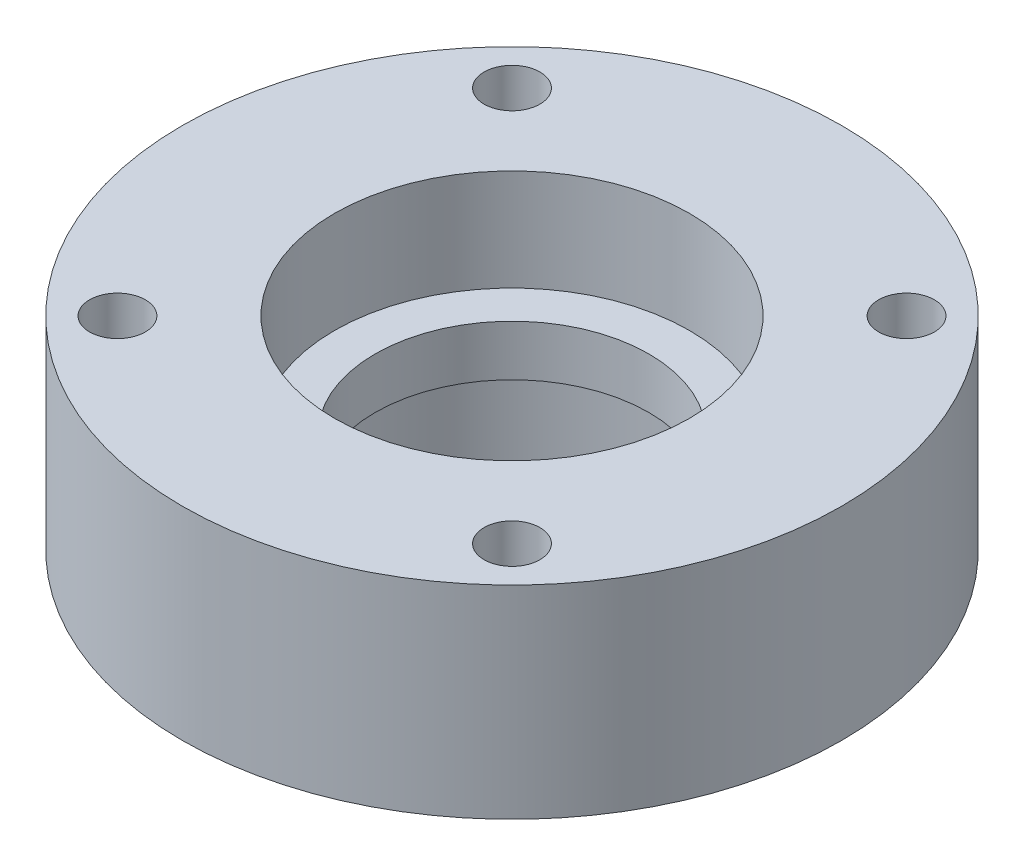
ISO-10303-21;
HEADER;
FILE_DESCRIPTION(('STEP AP214'),'2;1');
FILE_NAME('part.step','',(''),(''),'','','');
FILE_SCHEMA(('AUTOMOTIVE_DESIGN { 1 0 10303 214 1 1 1 1 }'));
ENDSEC;
DATA;
#1=APPLICATION_CONTEXT('core data for automotive mechanical design processes');
#2=APPLICATION_PROTOCOL_DEFINITION('international standard','automotive_design',2000,#1);
#3=PRODUCT_CONTEXT('',#1,'mechanical');
#4=PRODUCT('Part','Part','',(#3));
#5=PRODUCT_RELATED_PRODUCT_CATEGORY('part','',(#4));
#6=PRODUCT_DEFINITION_FORMATION('','',#4);
#7=PRODUCT_DEFINITION_CONTEXT('part definition',#1,'design');
#8=PRODUCT_DEFINITION('design','',#6,#7);
#9=PRODUCT_DEFINITION_SHAPE('','',#8);
#10=(LENGTH_UNIT() NAMED_UNIT(*) SI_UNIT(.MILLI.,.METRE.));
#11=(NAMED_UNIT(*) PLANE_ANGLE_UNIT() SI_UNIT($,.RADIAN.));
#12=(NAMED_UNIT(*) SI_UNIT($,.STERADIAN.) SOLID_ANGLE_UNIT());
#13=UNCERTAINTY_MEASURE_WITH_UNIT(LENGTH_MEASURE(1.E-05),#10,'distance_accuracy_value','');
#14=(GEOMETRIC_REPRESENTATION_CONTEXT(3) GLOBAL_UNCERTAINTY_ASSIGNED_CONTEXT((#13)) GLOBAL_UNIT_ASSIGNED_CONTEXT((#10,
#11,#12)) REPRESENTATION_CONTEXT('',''));
#15=CARTESIAN_POINT('',(0.,0.,0.));
#16=DIRECTION('',(0.,0.,1.));
#17=DIRECTION('',(1.,0.,0.));
#18=AXIS2_PLACEMENT_3D('',#15,#16,#17);
#19=CARTESIAN_POINT('',(17.5,5.,0.));
#20=DIRECTION('',(0.,1.,0.));
#21=DIRECTION('',(0.,0.,1.));
#22=AXIS2_PLACEMENT_3D('',#19,#20,#21);
#23=PLANE('',#22);
#24=CARTESIAN_POINT('',(0.,5.,0.));
#25=DIRECTION('',(0.,-1.,0.));
#26=DIRECTION('',(0.,0.,-1.));
#27=AXIS2_PLACEMENT_3D('',#24,#25,#26);
#28=CIRCLE('',#27,13.5);
#29=CARTESIAN_POINT('',(0.,5.,-13.5));
#30=VERTEX_POINT('',#29);
#31=EDGE_CURVE('E10',#30,#30,#28,.T.);
#32=ORIENTED_EDGE('',*,*,#31,.T.);
#33=EDGE_LOOP('',(#32));
#34=FACE_BOUND('',#33,.T.);
#35=CARTESIAN_POINT('',(0.,5.,0.));
#36=DIRECTION('',(0.,-1.,0.));
#37=DIRECTION('',(0.,0.,-1.));
#38=AXIS2_PLACEMENT_3D('',#35,#36,#37);
#39=CIRCLE('',#38,17.5);
#40=CARTESIAN_POINT('',(0.,5.,-17.5));
#41=VERTEX_POINT('',#40);
#42=EDGE_CURVE('E66',#41,#41,#39,.T.);
#43=ORIENTED_EDGE('',*,*,#42,.F.);
#44=EDGE_LOOP('',(#43));
#45=FACE_BOUND('',#44,.T.);
#46=ADVANCED_FACE('F32',(#34,#45),#23,.T.);
#47=CARTESIAN_POINT('',(0.,0.,0.));
#48=DIRECTION('',(0.,-1.,0.));
#49=DIRECTION('',(0.,0.,-1.));
#50=AXIS2_PLACEMENT_3D('',#47,#48,#49);
#51=CYLINDRICAL_SURFACE('',#50,13.5);
#52=CARTESIAN_POINT('',(0.,0.,0.));
#53=DIRECTION('',(0.,-1.,0.));
#54=DIRECTION('',(0.,0.,-1.));
#55=AXIS2_PLACEMENT_3D('',#52,#53,#54);
#56=CIRCLE('',#55,13.5);
#57=CARTESIAN_POINT('',(0.,0.,-13.5));
#58=VERTEX_POINT('',#57);
#59=EDGE_CURVE('E38',#58,#58,#56,.T.);
#60=ORIENTED_EDGE('',*,*,#59,.T.);
#61=EDGE_LOOP('',(#60));
#62=FACE_BOUND('',#61,.T.);
#63=ORIENTED_EDGE('',*,*,#31,.F.);
#64=EDGE_LOOP('',(#63));
#65=FACE_BOUND('',#64,.T.);
#66=ADVANCED_FACE('F145',(#62,#65),#51,.F.);
#67=CARTESIAN_POINT('',(13.5,0.,0.));
#68=DIRECTION('',(0.,-1.,0.));
#69=DIRECTION('',(0.,0.,-1.));
#70=AXIS2_PLACEMENT_3D('',#67,#68,#69);
#71=PLANE('',#70);
#72=CARTESIAN_POINT('',(0.,0.,0.));
#73=DIRECTION('',(0.,-1.,0.));
#74=DIRECTION('',(0.,0.,-1.));
#75=AXIS2_PLACEMENT_3D('',#72,#73,#74);
#76=CIRCLE('',#75,17.5);
#77=CARTESIAN_POINT('',(0.,0.,-17.5));
#78=VERTEX_POINT('',#77);
#79=EDGE_CURVE('E42',#78,#78,#76,.T.);
#80=ORIENTED_EDGE('',*,*,#79,.T.);
#81=EDGE_LOOP('',(#80));
#82=FACE_BOUND('',#81,.T.);
#83=ORIENTED_EDGE('',*,*,#59,.F.);
#84=EDGE_LOOP('',(#83));
#85=FACE_BOUND('',#84,.T.);
#86=ADVANCED_FACE('F139',(#82,#85),#71,.T.);
#87=CARTESIAN_POINT('',(0.,0.,0.));
#88=DIRECTION('',(0.,-1.,0.));
#89=DIRECTION('',(0.,0.,-1.));
#90=AXIS2_PLACEMENT_3D('',#87,#88,#89);
#91=CYLINDRICAL_SURFACE('',#90,17.5);
#92=CARTESIAN_POINT('',(0.,-10.,0.));
#93=DIRECTION('',(0.,-1.,0.));
#94=DIRECTION('',(0.,0.,-1.));
#95=AXIS2_PLACEMENT_3D('',#92,#93,#94);
#96=CIRCLE('',#95,17.5);
#97=CARTESIAN_POINT('',(0.,-10.,-17.5));
#98=VERTEX_POINT('',#97);
#99=EDGE_CURVE('E46',#98,#98,#96,.T.);
#100=ORIENTED_EDGE('',*,*,#99,.T.);
#101=EDGE_LOOP('',(#100));
#102=FACE_BOUND('',#101,.T.);
#103=ORIENTED_EDGE('',*,*,#79,.F.);
#104=EDGE_LOOP('',(#103));
#105=FACE_BOUND('',#104,.T.);
#106=ADVANCED_FACE('F133',(#102,#105),#91,.F.);
#107=CARTESIAN_POINT('',(17.5,-10.,0.));
#108=DIRECTION('',(0.,-1.,0.));
#109=DIRECTION('',(0.,0.,-1.));
#110=AXIS2_PLACEMENT_3D('',#107,#108,#109);
#111=PLANE('',#110);
#112=CARTESIAN_POINT('',(0.,-10.,0.));
#113=DIRECTION('',(0.,-1.,0.));
#114=DIRECTION('',(0.,0.,-1.));
#115=AXIS2_PLACEMENT_3D('',#112,#113,#114);
#116=CIRCLE('',#115,22.5);
#117=CARTESIAN_POINT('',(0.,-10.,-22.5));
#118=VERTEX_POINT('',#117);
#119=EDGE_CURVE('E51',#118,#118,#116,.T.);
#120=ORIENTED_EDGE('',*,*,#119,.T.);
#121=EDGE_LOOP('',(#120));
#122=FACE_BOUND('',#121,.T.);
#123=ORIENTED_EDGE('',*,*,#99,.F.);
#124=EDGE_LOOP('',(#123));
#125=FACE_BOUND('',#124,.T.);
#126=ADVANCED_FACE('F127',(#122,#125),#111,.T.);
#127=CARTESIAN_POINT('',(0.,0.,0.));
#128=DIRECTION('',(0.,-1.,0.));
#129=DIRECTION('',(0.,0.,-1.));
#130=AXIS2_PLACEMENT_3D('',#127,#128,#129);
#131=CYLINDRICAL_SURFACE('',#130,22.5);
#132=CARTESIAN_POINT('',(0.,-5.,0.));
#133=DIRECTION('',(0.,-1.,0.));
#134=DIRECTION('',(0.,0.,-1.));
#135=AXIS2_PLACEMENT_3D('',#132,#133,#134);
#136=CIRCLE('',#135,22.5);
#137=CARTESIAN_POINT('',(0.,-5.,-22.5));
#138=VERTEX_POINT('',#137);
#139=EDGE_CURVE('E54',#138,#138,#136,.T.);
#140=ORIENTED_EDGE('',*,*,#139,.T.);
#141=EDGE_LOOP('',(#140));
#142=FACE_BOUND('',#141,.T.);
#143=ORIENTED_EDGE('',*,*,#119,.F.);
#144=EDGE_LOOP('',(#143));
#145=FACE_BOUND('',#144,.T.);
#146=ADVANCED_FACE('F120',(#142,#145),#131,.T.);
#147=CARTESIAN_POINT('',(22.5,-5.,0.));
#148=DIRECTION('',(0.,-1.,0.));
#149=DIRECTION('',(0.,0.,-1.));
#150=AXIS2_PLACEMENT_3D('',#147,#148,#149);
#151=PLANE('',#150);
#152=CARTESIAN_POINT('',(-19.4454364826301,-5.,19.4454364826301));
#153=DIRECTION('',(0.,-1.,0.));
#154=DIRECTION('',(0.,0.,-1.));
#155=AXIS2_PLACEMENT_3D('',#152,#153,#154);
#156=CIRCLE('',#155,2.74999999999999);
#157=CARTESIAN_POINT('',(-19.4454364826301,-5.,16.6954364826301));
#158=VERTEX_POINT('',#157);
#159=EDGE_CURVE('E87',#158,#158,#156,.T.);
#160=ORIENTED_EDGE('',*,*,#159,.F.);
#161=EDGE_LOOP('',(#160));
#162=FACE_BOUND('',#161,.T.);
#163=CARTESIAN_POINT('',(-19.4454364826301,-5.,-19.4454364826301));
#164=DIRECTION('',(0.,-1.,0.));
#165=DIRECTION('',(0.,0.,-1.));
#166=AXIS2_PLACEMENT_3D('',#163,#164,#165);
#167=CIRCLE('',#166,2.74999999999999);
#168=CARTESIAN_POINT('',(-19.4454364826301,-5.,-22.1954364826301));
#169=VERTEX_POINT('',#168);
#170=EDGE_CURVE('E81',#169,#169,#167,.T.);
#171=ORIENTED_EDGE('',*,*,#170,.F.);
#172=EDGE_LOOP('',(#171));
#173=FACE_BOUND('',#172,.T.);
#174=CARTESIAN_POINT('',(19.4454364826301,-5.,-19.4454364826301));
#175=DIRECTION('',(0.,-1.,0.));
#176=DIRECTION('',(0.,0.,-1.));
#177=AXIS2_PLACEMENT_3D('',#174,#175,#176);
#178=CIRCLE('',#177,2.74999999999999);
#179=CARTESIAN_POINT('',(19.4454364826301,-5.,-22.1954364826301));
#180=VERTEX_POINT('',#179);
#181=EDGE_CURVE('E75',#180,#180,#178,.T.);
#182=ORIENTED_EDGE('',*,*,#181,.F.);
#183=EDGE_LOOP('',(#182));
#184=FACE_BOUND('',#183,.T.);
#185=CARTESIAN_POINT('',(19.4454364826301,-5.,19.4454364826301));
#186=DIRECTION('',(0.,-1.,0.));
#187=DIRECTION('',(0.,0.,-1.));
#188=AXIS2_PLACEMENT_3D('',#185,#186,#187);
#189=CIRCLE('',#188,2.74999999999999);
#190=CARTESIAN_POINT('',(19.4454364826301,-5.,16.6954364826301));
#191=VERTEX_POINT('',#190);
#192=EDGE_CURVE('E69',#191,#191,#189,.T.);
#193=ORIENTED_EDGE('',*,*,#192,.F.);
#194=EDGE_LOOP('',(#193));
#195=FACE_BOUND('',#194,.T.);
#196=CARTESIAN_POINT('',(0.,-5.,0.));
#197=DIRECTION('',(0.,-1.,0.));
#198=DIRECTION('',(0.,0.,-1.));
#199=AXIS2_PLACEMENT_3D('',#196,#197,#198);
#200=CIRCLE('',#199,32.5);
#201=CARTESIAN_POINT('',(0.,-5.,-32.5));
#202=VERTEX_POINT('',#201);
#203=EDGE_CURVE('E57',#202,#202,#200,.T.);
#204=ORIENTED_EDGE('',*,*,#203,.T.);
#205=EDGE_LOOP('',(#204));
#206=FACE_BOUND('',#205,.T.);
#207=ORIENTED_EDGE('',*,*,#139,.F.);
#208=EDGE_LOOP('',(#207));
#209=FACE_BOUND('',#208,.T.);
#210=ADVANCED_FACE('F114',(#162,#173,#184,#195,#206,#209),#151,.T.);
#211=CARTESIAN_POINT('',(0.,0.,0.));
#212=DIRECTION('',(0.,-1.,0.));
#213=DIRECTION('',(0.,0.,-1.));
#214=AXIS2_PLACEMENT_3D('',#211,#212,#213);
#215=CYLINDRICAL_SURFACE('',#214,32.5);
#216=CARTESIAN_POINT('',(0.,15.,0.));
#217=DIRECTION('',(0.,-1.,0.));
#218=DIRECTION('',(0.,0.,-1.));
#219=AXIS2_PLACEMENT_3D('',#216,#217,#218);
#220=CIRCLE('',#219,32.5);
#221=CARTESIAN_POINT('',(0.,15.,-32.5));
#222=VERTEX_POINT('',#221);
#223=EDGE_CURVE('E60',#222,#222,#220,.T.);
#224=ORIENTED_EDGE('',*,*,#223,.T.);
#225=EDGE_LOOP('',(#224));
#226=FACE_BOUND('',#225,.T.);
#227=ORIENTED_EDGE('',*,*,#203,.F.);
#228=EDGE_LOOP('',(#227));
#229=FACE_BOUND('',#228,.T.);
#230=ADVANCED_FACE('F100',(#226,#229),#215,.T.);
#231=CARTESIAN_POINT('',(32.5,15.,0.));
#232=DIRECTION('',(0.,1.,0.));
#233=DIRECTION('',(0.,0.,1.));
#234=AXIS2_PLACEMENT_3D('',#231,#232,#233);
#235=PLANE('',#234);
#236=CARTESIAN_POINT('',(-19.4454364826301,15.,19.4454364826301));
#237=DIRECTION('',(0.,1.,0.));
#238=DIRECTION('',(0.,0.,1.));
#239=AXIS2_PLACEMENT_3D('',#236,#237,#238);
#240=CIRCLE('',#239,2.74999999999999);
#241=CARTESIAN_POINT('',(-19.4454364826301,15.,22.19543648263));
#242=VERTEX_POINT('',#241);
#243=EDGE_CURVE('E90',#242,#242,#240,.T.);
#244=ORIENTED_EDGE('',*,*,#243,.F.);
#245=EDGE_LOOP('',(#244));
#246=FACE_BOUND('',#245,.T.);
#247=CARTESIAN_POINT('',(-19.4454364826301,15.,-19.4454364826301));
#248=DIRECTION('',(0.,1.,0.));
#249=DIRECTION('',(0.,0.,1.));
#250=AXIS2_PLACEMENT_3D('',#247,#248,#249);
#251=CIRCLE('',#250,2.74999999999999);
#252=CARTESIAN_POINT('',(-19.4454364826301,15.,-16.6954364826301));
#253=VERTEX_POINT('',#252);
#254=EDGE_CURVE('E84',#253,#253,#251,.T.);
#255=ORIENTED_EDGE('',*,*,#254,.F.);
#256=EDGE_LOOP('',(#255));
#257=FACE_BOUND('',#256,.T.);
#258=CARTESIAN_POINT('',(19.4454364826301,15.,-19.4454364826301));
#259=DIRECTION('',(0.,1.,0.));
#260=DIRECTION('',(0.,0.,1.));
#261=AXIS2_PLACEMENT_3D('',#258,#259,#260);
#262=CIRCLE('',#261,2.74999999999999);
#263=CARTESIAN_POINT('',(19.4454364826301,15.,-16.6954364826301));
#264=VERTEX_POINT('',#263);
#265=EDGE_CURVE('E78',#264,#264,#262,.T.);
#266=ORIENTED_EDGE('',*,*,#265,.F.);
#267=EDGE_LOOP('',(#266));
#268=FACE_BOUND('',#267,.T.);
#269=CARTESIAN_POINT('',(19.4454364826301,15.,19.4454364826301));
#270=DIRECTION('',(0.,1.,0.));
#271=DIRECTION('',(0.,0.,1.));
#272=AXIS2_PLACEMENT_3D('',#269,#270,#271);
#273=CIRCLE('',#272,2.74999999999999);
#274=CARTESIAN_POINT('',(19.4454364826301,15.,22.19543648263));
#275=VERTEX_POINT('',#274);
#276=EDGE_CURVE('E72',#275,#275,#273,.T.);
#277=ORIENTED_EDGE('',*,*,#276,.F.);
#278=EDGE_LOOP('',(#277));
#279=FACE_BOUND('',#278,.T.);
#280=CARTESIAN_POINT('',(0.,15.,0.));
#281=DIRECTION('',(0.,-1.,0.));
#282=DIRECTION('',(0.,0.,-1.));
#283=AXIS2_PLACEMENT_3D('',#280,#281,#282);
#284=CIRCLE('',#283,17.5);
#285=CARTESIAN_POINT('',(0.,15.,-17.5));
#286=VERTEX_POINT('',#285);
#287=EDGE_CURVE('E63',#286,#286,#284,.T.);
#288=ORIENTED_EDGE('',*,*,#287,.T.);
#289=EDGE_LOOP('',(#288));
#290=FACE_BOUND('',#289,.T.);
#291=ORIENTED_EDGE('',*,*,#223,.F.);
#292=EDGE_LOOP('',(#291));
#293=FACE_BOUND('',#292,.T.);
#294=ADVANCED_FACE('F96',(#246,#257,#268,#279,#290,#293),#235,.T.);
#295=CARTESIAN_POINT('',(0.,0.,0.));
#296=DIRECTION('',(0.,-1.,0.));
#297=DIRECTION('',(0.,0.,-1.));
#298=AXIS2_PLACEMENT_3D('',#295,#296,#297);
#299=CYLINDRICAL_SURFACE('',#298,17.5);
#300=ORIENTED_EDGE('',*,*,#42,.T.);
#301=EDGE_LOOP('',(#300));
#302=FACE_BOUND('',#301,.T.);
#303=ORIENTED_EDGE('',*,*,#287,.F.);
#304=EDGE_LOOP('',(#303));
#305=FACE_BOUND('',#304,.T.);
#306=ADVANCED_FACE('F99',(#302,#305),#299,.F.);
#307=CARTESIAN_POINT('',(19.4454364826301,15.,19.4454364826301));
#308=DIRECTION('',(0.,1.,0.));
#309=DIRECTION('',(0.,0.,1.));
#310=AXIS2_PLACEMENT_3D('',#307,#308,#309);
#311=CYLINDRICAL_SURFACE('',#310,2.74999999999999);
#312=ORIENTED_EDGE('',*,*,#192,.T.);
#313=EDGE_LOOP('',(#312));
#314=FACE_BOUND('',#313,.T.);
#315=ORIENTED_EDGE('',*,*,#276,.T.);
#316=EDGE_LOOP('',(#315));
#317=FACE_BOUND('',#316,.T.);
#318=ADVANCED_FACE('F158',(#314,#317),#311,.F.);
#319=CARTESIAN_POINT('',(19.4454364826301,15.,-19.4454364826301));
#320=DIRECTION('',(0.,1.,0.));
#321=DIRECTION('',(0.,0.,1.));
#322=AXIS2_PLACEMENT_3D('',#319,#320,#321);
#323=CYLINDRICAL_SURFACE('',#322,2.74999999999999);
#324=ORIENTED_EDGE('',*,*,#181,.T.);
#325=EDGE_LOOP('',(#324));
#326=FACE_BOUND('',#325,.T.);
#327=ORIENTED_EDGE('',*,*,#265,.T.);
#328=EDGE_LOOP('',(#327));
#329=FACE_BOUND('',#328,.T.);
#330=ADVANCED_FACE('F163',(#326,#329),#323,.F.);
#331=CARTESIAN_POINT('',(-19.4454364826301,15.,-19.4454364826301));
#332=DIRECTION('',(0.,1.,0.));
#333=DIRECTION('',(0.,0.,1.));
#334=AXIS2_PLACEMENT_3D('',#331,#332,#333);
#335=CYLINDRICAL_SURFACE('',#334,2.74999999999999);
#336=ORIENTED_EDGE('',*,*,#170,.T.);
#337=EDGE_LOOP('',(#336));
#338=FACE_BOUND('',#337,.T.);
#339=ORIENTED_EDGE('',*,*,#254,.T.);
#340=EDGE_LOOP('',(#339));
#341=FACE_BOUND('',#340,.T.);
#342=ADVANCED_FACE('F169',(#338,#341),#335,.F.);
#343=CARTESIAN_POINT('',(-19.4454364826301,15.,19.4454364826301));
#344=DIRECTION('',(0.,1.,0.));
#345=DIRECTION('',(0.,0.,1.));
#346=AXIS2_PLACEMENT_3D('',#343,#344,#345);
#347=CYLINDRICAL_SURFACE('',#346,2.74999999999999);
#348=ORIENTED_EDGE('',*,*,#159,.T.);
#349=EDGE_LOOP('',(#348));
#350=FACE_BOUND('',#349,.T.);
#351=ORIENTED_EDGE('',*,*,#243,.T.);
#352=EDGE_LOOP('',(#351));
#353=FACE_BOUND('',#352,.T.);
#354=ADVANCED_FACE('F94',(#350,#353),#347,.F.);
#355=CLOSED_SHELL('',(#46,#66,#86,#106,#126,#146,#210,#230,#294,#306,#318,#330,#342,#354));
#356=MANIFOLD_SOLID_BREP('B2',#355);
#357=ADVANCED_BREP_SHAPE_REPRESENTATION('',(#18,#356),#14);
#358=SHAPE_DEFINITION_REPRESENTATION(#9,#357);
ENDSEC;
END-ISO-10303-21;
